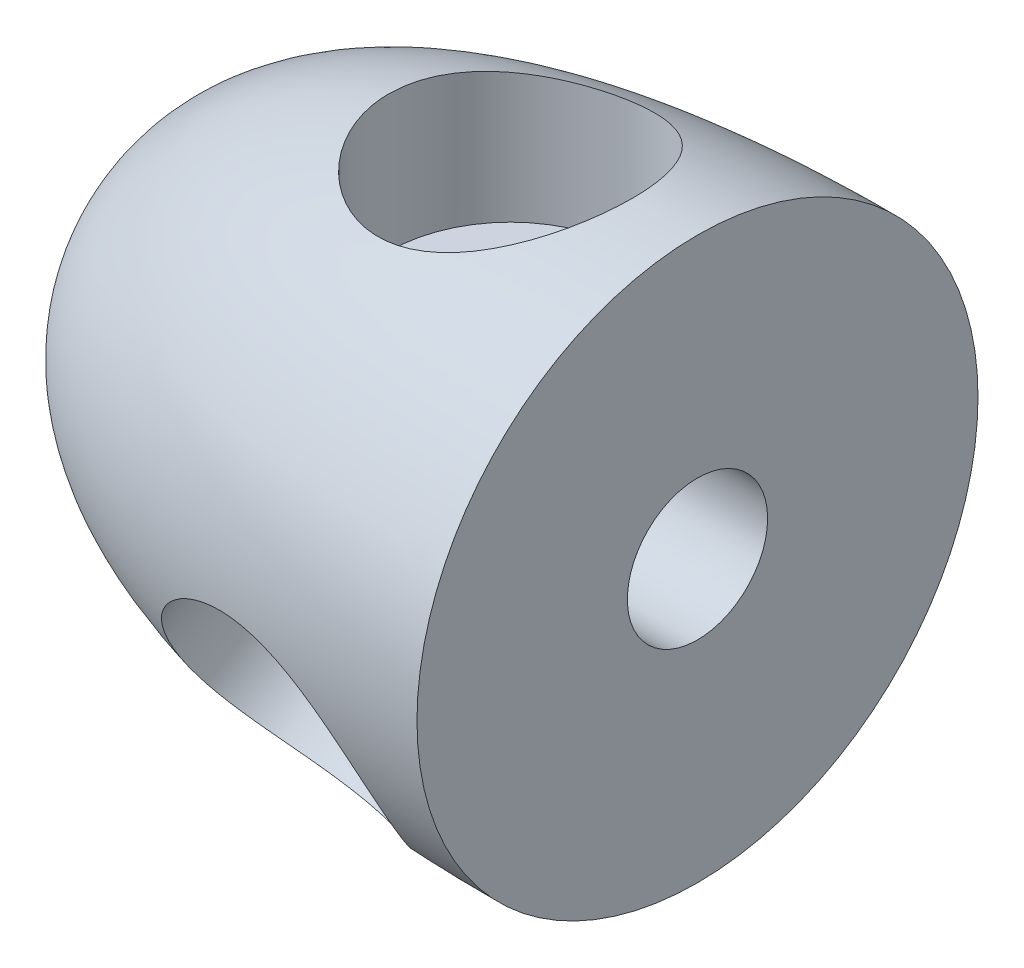
ISO-10303-21;
HEADER;
FILE_DESCRIPTION(('STEP AP214'),'2;1');
FILE_NAME('part.step','',(''),(''),'','','');
FILE_SCHEMA(('AUTOMOTIVE_DESIGN { 1 0 10303 214 1 1 1 1 }'));
ENDSEC;
DATA;
#1=APPLICATION_CONTEXT('core data for automotive mechanical design processes');
#2=APPLICATION_PROTOCOL_DEFINITION('international standard','automotive_design',2000,#1);
#3=PRODUCT_CONTEXT('',#1,'mechanical');
#4=PRODUCT('Part','Part','',(#3));
#5=PRODUCT_RELATED_PRODUCT_CATEGORY('part','',(#4));
#6=PRODUCT_DEFINITION_FORMATION('','',#4);
#7=PRODUCT_DEFINITION_CONTEXT('part definition',#1,'design');
#8=PRODUCT_DEFINITION('design','',#6,#7);
#9=PRODUCT_DEFINITION_SHAPE('','',#8);
#10=(LENGTH_UNIT() NAMED_UNIT(*) SI_UNIT(.MILLI.,.METRE.));
#11=(NAMED_UNIT(*) PLANE_ANGLE_UNIT() SI_UNIT($,.RADIAN.));
#12=(NAMED_UNIT(*) SI_UNIT($,.STERADIAN.) SOLID_ANGLE_UNIT());
#13=UNCERTAINTY_MEASURE_WITH_UNIT(LENGTH_MEASURE(1.E-05),#10,'distance_accuracy_value','');
#14=(GEOMETRIC_REPRESENTATION_CONTEXT(3) GLOBAL_UNCERTAINTY_ASSIGNED_CONTEXT((#13)) GLOBAL_UNIT_ASSIGNED_CONTEXT((#10,
#11,#12)) REPRESENTATION_CONTEXT('',''));
#15=CARTESIAN_POINT('',(0.,0.,0.));
#16=DIRECTION('',(0.,0.,1.));
#17=DIRECTION('',(1.,0.,0.));
#18=AXIS2_PLACEMENT_3D('',#15,#16,#17);
#19=CARTESIAN_POINT('',(0.,19.05,0.));
#20=CARTESIAN_POINT('',(-14.1990316571237,19.05,0.));
#21=CARTESIAN_POINT('',(-38.1,16.9337441759972,0.));
#22=CARTESIAN_POINT('',(-38.1,0.,0.));
#23=B_SPLINE_CURVE_WITH_KNOTS('',3,(#19,#20,#21,#22),.UNSPECIFIED.,.F.,.F.,(4,4),(0.,1.),.UNSPECIFIED.);
#24=CARTESIAN_POINT('',(0.,0.,0.));
#25=DIRECTION('',(1.,0.,0.));
#26=AXIS1_PLACEMENT('',#24,#25);
#27=SURFACE_OF_REVOLUTION('',#23,#26);
#28=CARTESIAN_POINT('',(-12.7,-1.05554135001207,18.3382512477111));
#29=CARTESIAN_POINT('',(-12.4678496731717,-1.07093817433811,18.3649182294069));
#30=CARTESIAN_POINT('',(-12.2361853486081,-1.09668677850686,18.3899135514848));
#31=CARTESIAN_POINT('',(-11.7756219296048,-1.1683230123203,18.4362695260958));
#32=CARTESIAN_POINT('',(-11.5467230720041,-1.21421235446174,18.457629869345));
#33=CARTESIAN_POINT('',(-11.093258589346,-1.32533467091383,18.4963258922248));
#34=CARTESIAN_POINT('',(-10.868694313289,-1.39057356697893,18.5136603368659));
#35=CARTESIAN_POINT('',(-10.4253438954722,-1.53942991294499,18.543823420776));
#36=CARTESIAN_POINT('',(-10.2065601958477,-1.62305499571124,18.5566501829566));
#37=CARTESIAN_POINT('',(-9.77696865141598,-1.80722726507867,18.5772041785311));
#38=CARTESIAN_POINT('',(-9.56613377152079,-1.90770925675279,18.5849505147031));
#39=CARTESIAN_POINT('',(-9.15269005922822,-2.12467383194726,18.5948372317379));
#40=CARTESIAN_POINT('',(-8.95008432704114,-2.2411623745741,18.596975518787));
#41=CARTESIAN_POINT('',(-8.3563654768225,-2.61281667795689,18.5940468730107));
#42=CARTESIAN_POINT('',(-7.97898978956349,-2.89032808962626,18.5796555798405));
#43=CARTESIAN_POINT('',(-7.24932499851591,-3.51234579087139,18.5191412013127));
#44=CARTESIAN_POINT('',(-6.89962515403691,-3.85973402987006,18.4712858372007));
#45=CARTESIAN_POINT('',(-6.41965144000054,-4.41361552426334,18.3701428901183));
#46=CARTESIAN_POINT('',(-6.26700842005648,-4.60383787953932,18.3315020373663));
#47=CARTESIAN_POINT('',(-5.97770345653988,-4.99374740063869,18.2437946413867));
#48=CARTESIAN_POINT('',(-5.84103430504733,-5.19343023997943,18.1947328288049));
#49=CARTESIAN_POINT('',(-5.58526199411527,-5.59996143913154,18.0858398892811));
#50=CARTESIAN_POINT('',(-5.46610156373598,-5.80678357463183,18.0260453625685));
#51=CARTESIAN_POINT('',(-5.24600408983275,-6.22637837158234,17.8952411710938));
#52=CARTESIAN_POINT('',(-5.14505832090734,-6.43914812721644,17.8242369068793));
#53=CARTESIAN_POINT('',(-4.96246806797866,-6.86874897192233,17.6708527449552));
#54=CARTESIAN_POINT('',(-4.88081692445505,-7.08557863175374,17.5884767877709));
#55=CARTESIAN_POINT('',(-4.73777797913458,-7.52131771194806,17.412410425798));
#56=CARTESIAN_POINT('',(-4.67638817080212,-7.74022692415689,17.318721142655));
#57=CARTESIAN_POINT('',(-4.57898498798811,-8.15947037285861,17.1287772814262));
#58=CARTESIAN_POINT('',(-4.5412655712239,-8.35981103963301,17.0334085242228));
#59=CARTESIAN_POINT('',(-4.48393789613877,-8.75875537955957,16.8339919722101));
#60=CARTESIAN_POINT('',(-4.46432856606679,-8.95735915481149,16.7299446913915));
#61=CARTESIAN_POINT('',(-4.44346638779167,-9.35110155372741,16.5139138842047));
#62=CARTESIAN_POINT('',(-4.44220761064571,-9.54624127625086,16.4019329329039));
#63=CARTESIAN_POINT('',(-4.45804742712007,-9.93152716618519,16.170908758721));
#64=CARTESIAN_POINT('',(-4.47514549995472,-10.1216734751029,16.051865736281));
#65=CARTESIAN_POINT('',(-4.5258861993133,-10.4841030877928,15.8152333169481));
#66=CARTESIAN_POINT('',(-4.55845701080148,-10.6567687933163,15.697997489485));
#67=CARTESIAN_POINT('',(-4.63924612753854,-10.9953216344241,15.4592331864884));
#68=CARTESIAN_POINT('',(-4.68746362640651,-11.1612091188405,15.3377049324605));
#69=CARTESIAN_POINT('',(-4.79906366205308,-11.4852941410762,15.0913980021993));
#70=CARTESIAN_POINT('',(-4.86244697861413,-11.6434912829771,14.9666191591242));
#71=CARTESIAN_POINT('',(-5.00378327196462,-11.9514291871467,14.7149017292706));
#72=CARTESIAN_POINT('',(-5.08173678845554,-12.1011696358995,14.5879630626474));
#73=CARTESIAN_POINT('',(-5.25391200458625,-12.3956390768418,14.3294700277123));
#74=CARTESIAN_POINT('',(-5.34852689622287,-12.5401117017246,14.1978856894738));
#75=CARTESIAN_POINT('',(-5.55169309063149,-12.8190293820455,13.9347442282574));
#76=CARTESIAN_POINT('',(-5.66024940049296,-12.9534708071959,13.8031871321501));
#77=CARTESIAN_POINT('',(-5.89047385877716,-13.2119141344801,13.5413133267622));
#78=CARTESIAN_POINT('',(-6.0121412221108,-13.3359166609035,13.4109965437197));
#79=CARTESIAN_POINT('',(-6.26779471884967,-13.5732684307527,13.1527264924107));
#80=CARTESIAN_POINT('',(-6.40178527657435,-13.6866138182442,13.0247740929696));
#81=CARTESIAN_POINT('',(-6.84480526438208,-14.0287096958183,12.6247300295763));
#82=CARTESIAN_POINT('',(-7.17539968096999,-14.2375303623417,12.3589373366593));
#83=CARTESIAN_POINT('',(-7.88325943146312,-14.6033733652481,11.8549834536762));
#84=CARTESIAN_POINT('',(-8.26054777438221,-14.760370023854,11.6168359990549));
#85=CARTESIAN_POINT('',(-8.86674926883624,-14.9605367051593,11.2824063208886));
#86=CARTESIAN_POINT('',(-9.08199463665295,-15.0225146747977,11.1720785174867));
#87=CARTESIAN_POINT('',(-9.52199859584118,-15.1317977233363,10.9639067326778));
#88=CARTESIAN_POINT('',(-9.74675346065383,-15.1791084905566,10.8660579202839));
#89=CARTESIAN_POINT('',(-10.2043999532849,-15.258987670139,10.6844029170312));
#90=CARTESIAN_POINT('',(-10.4372912782346,-15.2915566306165,10.600596204146));
#91=CARTESIAN_POINT('',(-10.9096555883844,-15.341863951998,10.4484923115474));
#92=CARTESIAN_POINT('',(-11.1491281591345,-15.3596032445911,10.3801941576893));
#93=CARTESIAN_POINT('',(-11.6236859720653,-15.3797670773218,10.2626882748266));
#94=CARTESIAN_POINT('',(-11.8585922921589,-15.3827478029013,10.2128538910677));
#95=CARTESIAN_POINT('',(-12.3310874850779,-15.3748316020286,10.1296824158725));
#96=CARTESIAN_POINT('',(-12.568676303217,-15.3639349579802,10.0963449887431));
#97=CARTESIAN_POINT('',(-13.0444822172277,-15.3282441475136,10.0468207934743));
#98=CARTESIAN_POINT('',(-13.2826989390589,-15.3034569406822,10.0306254483693));
#99=CARTESIAN_POINT('',(-13.7578253980251,-15.2400153123233,10.015636219971));
#100=CARTESIAN_POINT('',(-13.9947352176626,-15.2013617765646,10.0168412253516));
#101=CARTESIAN_POINT('',(-14.4468325037665,-15.113828609025,10.0357594501449));
#102=CARTESIAN_POINT('',(-14.6622753211812,-15.0659792503867,10.052180297517));
#103=CARTESIAN_POINT('',(-15.0886532303629,-14.9586889702085,10.0993142558216));
#104=CARTESIAN_POINT('',(-15.2995885805953,-14.8992487152985,10.1300265449479));
#105=CARTESIAN_POINT('',(-15.7154176894971,-14.768935242173,10.205089197667));
#106=CARTESIAN_POINT('',(-15.9203111805072,-14.6980615183428,10.2494401644727));
#107=CARTESIAN_POINT('',(-16.3226060284733,-14.5450794973276,10.3509023498163));
#108=CARTESIAN_POINT('',(-16.5200072357702,-14.4629709758772,10.4080138230898));
#109=CARTESIAN_POINT('',(-16.9047731851232,-14.2882993345626,10.5335508809668));
#110=CARTESIAN_POINT('',(-17.0921931315981,-14.1958050479399,10.6019032232757));
#111=CARTESIAN_POINT('',(-17.4572031591913,-14.0001636897908,10.7490491768934));
#112=CARTESIAN_POINT('',(-17.6347896427329,-13.8970127585634,10.8278465742137));
#113=CARTESIAN_POINT('',(-17.9789838177882,-13.6803640447362,10.9946390723192));
#114=CARTESIAN_POINT('',(-18.1455916398603,-13.566866385218,11.0826340636941));
#115=CARTESIAN_POINT('',(-18.46685777712,-13.3298309618759,11.2665617872103));
#116=CARTESIAN_POINT('',(-18.6215156654916,-13.2062928397596,11.3624948026209));
#117=CARTESIAN_POINT('',(-18.9250930939468,-12.9433707641879,11.5657845502716));
#118=CARTESIAN_POINT('',(-19.0733820940629,-12.8035110818781,11.6734684582794));
#119=CARTESIAN_POINT('',(-19.3548356830691,-12.5136897888083,11.894641716706));
#120=CARTESIAN_POINT('',(-19.4880064744523,-12.363732361336,12.0081286584156));
#121=CARTESIAN_POINT('',(-19.7384828380389,-12.0541461090567,12.2395685677634));
#122=CARTESIAN_POINT('',(-19.8557805208199,-11.8945125315625,12.3575237192323));
#123=CARTESIAN_POINT('',(-20.0735855498831,-11.5663747279972,12.5963917137113));
#124=CARTESIAN_POINT('',(-20.1740992941907,-11.3978739144723,12.7173034094455));
#125=CARTESIAN_POINT('',(-20.3591644265225,-11.0499238387093,12.9627496499754));
#126=CARTESIAN_POINT('',(-20.4434292117247,-10.8703409677531,13.0873111269466));
#127=CARTESIAN_POINT('',(-20.5932687876938,-10.5037464464385,13.3367558754058));
#128=CARTESIAN_POINT('',(-20.6588433137755,-10.3167346909173,13.4616391514257));
#129=CARTESIAN_POINT('',(-20.770756683274,-9.93643745243655,13.7104131336544));
#130=CARTESIAN_POINT('',(-20.817098242681,-9.74315285945709,13.8343039775849));
#131=CARTESIAN_POINT('',(-20.8901638498285,-9.35155993603963,14.0799092494355));
#132=CARTESIAN_POINT('',(-20.9168883734726,-9.15325172759381,14.2016237300836));
#133=CARTESIAN_POINT('',(-20.9500990228065,-8.75766040063276,14.4390075561227));
#134=CARTESIAN_POINT('',(-20.9570402290159,-8.56046020899384,14.5547516356647));
#135=CARTESIAN_POINT('',(-20.9519268496546,-8.16401731592111,14.7822493393943));
#136=CARTESIAN_POINT('',(-20.9398725474943,-7.96477464500489,14.8940030230925));
#137=CARTESIAN_POINT('',(-20.896870884421,-7.56574328093139,15.1127738289624));
#138=CARTESIAN_POINT('',(-20.8659244142849,-7.36595461396029,15.2197911742));
#139=CARTESIAN_POINT('',(-20.785395324947,-6.96735933493857,15.4285067385448));
#140=CARTESIAN_POINT('',(-20.7358126881345,-6.76855272381615,15.5302049526255));
#141=CARTESIAN_POINT('',(-20.6189474757692,-6.37529297170968,15.7269479952205));
#142=CARTESIAN_POINT('',(-20.5518307354046,-6.18081665149887,15.8220451181098));
#143=CARTESIAN_POINT('',(-20.400202947753,-5.79589205553348,16.0063283039084));
#144=CARTESIAN_POINT('',(-20.3156920463741,-5.60544374600532,16.095514416393));
#145=CARTESIAN_POINT('',(-20.1298929254751,-5.23009847528198,16.267852317792));
#146=CARTESIAN_POINT('',(-20.0286055031384,-5.04520125080431,16.3510043931607));
#147=CARTESIAN_POINT('',(-19.809908927268,-4.68237647023571,16.5113237467028));
#148=CARTESIAN_POINT('',(-19.6924936134865,-4.50445161086404,16.5884887203195));
#149=CARTESIAN_POINT('',(-19.4395968588325,-4.15330652739349,16.7385619807426));
#150=CARTESIAN_POINT('',(-19.3037755367243,-3.98027519848074,16.8113397137552));
#151=CARTESIAN_POINT('',(-19.0169676165429,-3.64458174542633,16.9510286897099));
#152=CARTESIAN_POINT('',(-18.865974022994,-3.48192446146757,17.0179371996549));
#153=CARTESIAN_POINT('',(-18.5498210086171,-3.16856153131007,17.1461981869966));
#154=CARTESIAN_POINT('',(-18.3846590336764,-3.0178580494689,17.2075496585189));
#155=CARTESIAN_POINT('',(-18.041337903279,-2.72999869525697,17.3250513596962));
#156=CARTESIAN_POINT('',(-17.8631848980244,-2.59283648365998,17.3812040223544));
#157=CARTESIAN_POINT('',(-17.4930256788642,-2.33205274810865,17.4893398325382));
#158=CARTESIAN_POINT('',(-17.3008927306071,-2.20859001621148,17.5412725230222));
#159=CARTESIAN_POINT('',(-16.9058854913818,-1.97837101014384,17.6407232174064));
#160=CARTESIAN_POINT('',(-16.7030157475732,-1.87160773814121,17.6882430670774));
#161=CARTESIAN_POINT('',(-16.2880017151978,-1.67606411202289,17.7792982731085));
#162=CARTESIAN_POINT('',(-16.0758602851245,-1.58727826229667,17.8228348448998));
#163=CARTESIAN_POINT('',(-15.6438830739543,-1.42879439254817,17.9062996597299));
#164=CARTESIAN_POINT('',(-15.4240479453297,-1.35909475830171,17.9462282077274));
#165=CARTESIAN_POINT('',(-14.9988002703656,-1.24513559089126,18.0192589376756));
#166=CARTESIAN_POINT('',(-14.7939023959221,-1.19913487739774,18.0526515532853));
#167=CARTESIAN_POINT('',(-14.3806283743852,-1.12411175471069,18.1168125362719));
#168=CARTESIAN_POINT('',(-14.1722525154871,-1.0950879458772,18.1475811198052));
#169=CARTESIAN_POINT('',(-13.7534652694448,-1.05426898031285,18.2065397002261));
#170=CARTESIAN_POINT('',(-13.5430539365775,-1.04247336545047,18.234729765663));
#171=CARTESIAN_POINT('',(-13.1216284295418,-1.03612460484565,18.2884890761011));
#172=CARTESIAN_POINT('',(-12.910614207848,-1.04157285811673,18.3140581082815));
#173=CARTESIAN_POINT('',(-12.7,-1.05554135001207,18.3382512477111));
#174=B_SPLINE_CURVE_WITH_KNOTS('',3,(#28,#29,#30,#31,#32,#33,#34,#35,#36,#37,#38,#39,#40,#41,
#42,#43,#44,#45,#46,#47,#48,#49,#50,#51,#52,#53,#54,#55,#56,#57,#58,#59,#60,#61,#62,#63,#64,#65,
#66,#67,#68,#69,#70,#71,#72,#73,#74,#75,#76,#77,#78,#79,#80,#81,#82,#83,#84,#85,#86,#87,#88,#89,
#90,#91,#92,#93,#94,#95,#96,#97,#98,#99,#100,#101,#102,#103,#104,#105,#106,#107,#108,#109,#110,
#111,#112,#113,#114,#115,#116,#117,#118,#119,#120,#121,#122,#123,#124,#125,#126,#127,#128,#129,
#130,#131,#132,#133,#134,#135,#136,#137,#138,#139,#140,#141,#142,#143,#144,#145,#146,#147,#148,
#149,#150,#151,#152,#153,#154,#155,#156,#157,#158,#159,#160,#161,#162,#163,#164,#165,#166,#167,
#168,#169,#170,#171,#172,#173),.UNSPECIFIED.,.T.,.F.,(4,2,2,2,2,2,2,2,2,2,2,2,2,2,2,2,2,2,2,2,2,
2,2,2,2,2,2,2,2,2,2,2,2,2,2,2,2,2,2,2,2,2,2,2,2,2,2,2,2,2,2,2,2,2,2,2,2,2,2,2,2,2,2,2,2,2,2,2,2,
2,2,2,4),(0.,0.702339120622019,1.40473797026374,2.10735200486445,2.81025827617057,
3.51050618010433,4.21101549045035,5.61086560693613,7.08912729085839,7.82918021875546,
8.56889791126588,9.30613938713547,10.0430267578773,10.7796594199906,11.5162191094459,
12.1905359600728,12.8648129022142,13.5388719850851,14.2129119453374,14.845872541714,
15.4788005224773,16.1117610535613,16.7447450350757,17.3953887111609,18.0462667242279,
18.6971057843924,19.3481794302539,20.7601187408642,22.1727565932035,22.9210362541201,
23.6690253487586,24.4169866301249,25.1649009165281,25.8844030072394,26.6038904563473,
27.3230177426413,28.0420990999006,28.7052040868324,29.3682709476951,30.0313671389682,
30.6944765686889,31.3534251274967,32.0126131913854,32.6717934147854,33.3309971712702,
34.0218032214971,34.7123248250816,35.4031883883205,36.0937879906624,36.7956339889221,
37.4974899259959,38.1992467164912,38.9009864820106,39.5864483266729,40.2718999444319,
40.9573192452344,41.6427391937341,42.3218975117989,43.0010501330818,43.6801704917745,
44.3595509739886,45.0538386351859,45.7484478932396,46.4431826316451,47.137590578343,
47.8393528833919,48.540820325749,49.2420730080971,49.9432663633927,50.5804686876965,
51.217618471234,51.8547513113994,52.4919358441607),.UNSPECIFIED.);
#175=CARTESIAN_POINT('',(-12.7,-1.05554135001207,18.3382512477111));
#176=VERTEX_POINT('',#175);
#177=EDGE_CURVE('E60',#176,#176,#174,.T.);
#178=ORIENTED_EDGE('',*,*,#177,.T.);
#179=EDGE_LOOP('',(#178));
#180=FACE_BOUND('',#179,.T.);
#181=CARTESIAN_POINT('',(0.,0.,0.));
#182=DIRECTION('',(1.,0.,0.));
#183=DIRECTION('',(0.,0.,-1.));
#184=AXIS2_PLACEMENT_3D('',#181,#182,#183);
#185=CIRCLE('',#184,19.05);
#186=CARTESIAN_POINT('',(0.,0.,-19.05));
#187=VERTEX_POINT('',#186);
#188=EDGE_CURVE('E11',#187,#187,#185,.T.);
#189=ORIENTED_EDGE('',*,*,#188,.F.);
#190=EDGE_LOOP('',(#189));
#191=FACE_BOUND('',#190,.T.);
#192=CARTESIAN_POINT('',(-38.1,0.,0.));
#193=VERTEX_POINT('',#192);
#194=VERTEX_LOOP('',#193);
#195=FACE_BOUND('',#194,.T.);
#196=CARTESIAN_POINT('',(-4.445,18.9763018383334,0.));
#197=CARTESIAN_POINT('',(-4.44499943134379,18.9763022513523,0.218211078954213));
#198=CARTESIAN_POINT('',(-4.45366030489562,18.9722345507482,0.436414421110941));
#199=CARTESIAN_POINT('',(-4.48819912989362,18.9560573129827,0.871144042653203));
#200=CARTESIAN_POINT('',(-4.51407624568471,18.9439481661432,1.08767040292133));
#201=CARTESIAN_POINT('',(-4.5827492203617,18.9119582977859,1.51743998162799));
#202=CARTESIAN_POINT('',(-4.62554556523899,18.8920773530295,1.73068310557535));
#203=CARTESIAN_POINT('',(-4.72758451760102,18.8449772614248,2.15236542127592));
#204=CARTESIAN_POINT('',(-4.7868274328471,18.8177579772558,2.36080452305338));
#205=CARTESIAN_POINT('',(-4.92095129342314,18.7566429551785,2.7708903116773));
#206=CARTESIAN_POINT('',(-4.99578642220544,18.7227667942276,2.97255493238313));
#207=CARTESIAN_POINT('',(-5.16051655688713,18.6489552318792,3.3685649330167));
#208=CARTESIAN_POINT('',(-5.25041720064804,18.6090175626559,3.56290753940635));
#209=CARTESIAN_POINT('',(-5.44447441549829,18.5238613882089,3.94308256356839));
#210=CARTESIAN_POINT('',(-5.54862802511466,18.4786439802919,4.12891673854075));
#211=CARTESIAN_POINT('',(-5.7704065226972,18.3837451781798,4.49120576491487));
#212=CARTESIAN_POINT('',(-5.88803667293001,18.3340620418671,4.66765691282271));
#213=CARTESIAN_POINT('',(-6.27247776874592,18.1743938736086,5.19895753091009));
#214=CARTESIAN_POINT('',(-6.56105520849356,18.0581933062236,5.53653946005926));
#215=CARTESIAN_POINT('',(-7.18688875477692,17.8182337172331,6.16002799663893));
#216=CARTESIAN_POINT('',(-7.52416652293216,17.6944713463876,6.44591148077657));
#217=CARTESIAN_POINT('',(-8.075032362928,17.5048624089158,6.84188005031169));
#218=CARTESIAN_POINT('',(-8.27412310592406,17.4385706693425,6.97232701290918));
#219=CARTESIAN_POINT('',(-8.6832034833614,17.3076613694495,7.21574423415549));
#220=CARTESIAN_POINT('',(-8.8931893128504,17.2430432363096,7.32872054004017));
#221=CARTESIAN_POINT('',(-9.32298727432609,17.1167773433105,7.5364327117597));
#222=CARTESIAN_POINT('',(-9.54280429529894,17.0551310937352,7.63115937505361));
#223=CARTESIAN_POINT('',(-9.99077041766749,16.9361654206379,7.80144100117607));
#224=CARTESIAN_POINT('',(-10.2189157078014,16.8788440538589,7.87700461082378));
#225=CARTESIAN_POINT('',(-10.6810817340575,16.7699796676345,8.00789634162892));
#226=CARTESIAN_POINT('',(-10.915069997073,16.7184108746828,8.06331745887122));
#227=CARTESIAN_POINT('',(-11.3883141110105,16.6218330055621,8.15368195587698));
#228=CARTESIAN_POINT('',(-11.6275699894649,16.5768239636885,8.18862522858259));
#229=CARTESIAN_POINT('',(-12.1093616786253,16.4943015195881,8.23739996769746));
#230=CARTESIAN_POINT('',(-12.3518953845436,16.4567835305268,8.25124438777343));
#231=CARTESIAN_POINT('',(-12.8383512777448,16.3898765340559,8.25742313991828));
#232=CARTESIAN_POINT('',(-13.0822733452249,16.360486835786,8.2497593006894));
#233=CARTESIAN_POINT('',(-13.5500666920895,16.3121849419798,8.2141955490019));
#234=CARTESIAN_POINT('',(-13.7739981611929,16.2926279706806,8.18794386022029));
#235=CARTESIAN_POINT('',(-14.2194536208659,16.2607395680525,8.11708934597051));
#236=CARTESIAN_POINT('',(-14.4409777431511,16.2484077394339,8.07248752975279));
#237=CARTESIAN_POINT('',(-14.8798611433481,16.2307519281812,7.96519068206703));
#238=CARTESIAN_POINT('',(-15.0972207562774,16.2254273794884,7.90249711257765));
#239=CARTESIAN_POINT('',(-15.5261128375097,16.2213314487669,7.75945953938697));
#240=CARTESIAN_POINT('',(-15.7376453175164,16.2225600535756,7.67911557113857));
#241=CARTESIAN_POINT('',(-16.1458493451855,16.2307647735812,7.50457508652718));
#242=CARTESIAN_POINT('',(-16.3427818032117,16.2375335018484,7.41097763621885));
#243=CARTESIAN_POINT('',(-16.7285220946098,16.2558279815828,7.2085708011828));
#244=CARTESIAN_POINT('',(-16.9173270009474,16.267355431275,7.09975599507692));
#245=CARTESIAN_POINT('',(-17.2854959240342,16.2943371027011,6.86772081906003));
#246=CARTESIAN_POINT('',(-17.4648623631159,16.3097903109181,6.74450417171298));
#247=CARTESIAN_POINT('',(-17.8132053981539,16.3437457334768,6.48439893158072));
#248=CARTESIAN_POINT('',(-17.9821771991442,16.3622493406748,6.34750410444134));
#249=CARTESIAN_POINT('',(-18.3152103577446,16.4021716796698,6.0552020567276));
#250=CARTESIAN_POINT('',(-18.4788031586039,16.4236775492973,5.89927264206554));
#251=CARTESIAN_POINT('',(-18.7925127217833,16.4679575197658,5.57469612528407));
#252=CARTESIAN_POINT('',(-18.9426348603364,16.4907311087182,5.40605414672928));
#253=CARTESIAN_POINT('',(-19.2286301557967,16.5365717949922,5.05697074579832));
#254=CARTESIAN_POINT('',(-19.3644953752555,16.55963904788,4.87652284035333));
#255=CARTESIAN_POINT('',(-19.6209749158734,16.6051017750843,4.5051133162269));
#256=CARTESIAN_POINT('',(-19.7415946638148,16.6274974862654,4.31415547360708));
#257=CARTESIAN_POINT('',(-19.9705384415983,16.6714619631989,3.91645812717439));
#258=CARTESIAN_POINT('',(-20.0783310898386,16.6929797023879,3.7094066978972));
#259=CARTESIAN_POINT('',(-20.2760805494961,16.7335167325747,3.28671169170762));
#260=CARTESIAN_POINT('',(-20.3660369351839,16.7525359639327,3.07106790985397));
#261=CARTESIAN_POINT('',(-20.5274109324961,16.7873321839229,2.63271795327241));
#262=CARTESIAN_POINT('',(-20.5988303724397,16.8031094922775,2.41001247748034));
#263=CARTESIAN_POINT('',(-20.722562794009,16.8308187150126,1.95912240708194));
#264=CARTESIAN_POINT('',(-20.7748762066429,16.8427507161377,1.73093793619868));
#265=CARTESIAN_POINT('',(-20.8593060388737,16.862167114619,1.27429743598263));
#266=CARTESIAN_POINT('',(-20.8917195441849,16.8697168369112,1.04589910122417));
#267=CARTESIAN_POINT('',(-20.9373234739617,16.8803732168368,0.587087582102007));
#268=CARTESIAN_POINT('',(-20.9505140528723,16.8834799101674,0.356674413941251));
#269=CARTESIAN_POINT('',(-20.9575590623122,16.8851367227884,-0.104440347798195));
#270=CARTESIAN_POINT('',(-20.9514154249216,16.8836872973746,-0.335141910254485));
#271=CARTESIAN_POINT('',(-20.9198488275686,16.8762856898303,-0.795147399904788));
#272=CARTESIAN_POINT('',(-20.8944260553329,16.8703335515439,-1.02445134068594));
#273=CARTESIAN_POINT('',(-20.8251796394353,16.8542978216727,-1.47566642527761));
#274=CARTESIAN_POINT('',(-20.7817131288763,16.844294502676,-1.69763536511263));
#275=CARTESIAN_POINT('',(-20.6767790931137,16.8205177309705,-2.13706508685164));
#276=CARTESIAN_POINT('',(-20.6153118310892,16.8067443333823,-2.35452593461618));
#277=CARTESIAN_POINT('',(-20.4748429442883,16.7759166603932,-2.78348371165803));
#278=CARTESIAN_POINT('',(-20.3958400141737,16.7588621407613,-2.99498019563224));
#279=CARTESIAN_POINT('',(-20.2208820840775,16.7220882441522,-3.4106008540994));
#280=CARTESIAN_POINT('',(-20.1249267862386,16.7023688203534,-3.61472489898095));
#281=CARTESIAN_POINT('',(-19.9152507115201,16.6606963729058,-4.01713681004682));
#282=CARTESIAN_POINT('',(-19.8012961766436,16.6387155152994,-4.21529999495602));
#283=CARTESIAN_POINT('',(-19.5573791104245,16.59361052211,-4.60147289753046));
#284=CARTESIAN_POINT('',(-19.4274110392003,16.5704859925392,-4.78947906883911));
#285=CARTESIAN_POINT('',(-19.1523473609163,16.5240435684958,-5.15406499324502));
#286=CARTESIAN_POINT('',(-19.007251176789,16.5007256666783,-5.33064431004404));
#287=CARTESIAN_POINT('',(-18.7028639548384,16.4549068223632,-5.67122668747626));
#288=CARTESIAN_POINT('',(-18.5435729261658,16.432405879339,-5.83522975621659));
#289=CARTESIAN_POINT('',(-18.2082997949424,16.3888182793481,-6.15289390050983));
#290=CARTESIAN_POINT('',(-18.0320365925405,16.3677714426269,-6.30626402781222));
#291=CARTESIAN_POINT('',(-17.6669985719096,16.3287725442074,-6.59761037834034));
#292=CARTESIAN_POINT('',(-17.478228421858,16.3108193367313,-6.73559229414101));
#293=CARTESIAN_POINT('',(-17.0894125157816,16.2791161063752,-6.99519281227402));
#294=CARTESIAN_POINT('',(-16.889366834499,16.2653660556375,-7.11681152305516));
#295=CARTESIAN_POINT('',(-16.4794404949569,16.2431229530751,-7.34272545937975));
#296=CARTESIAN_POINT('',(-16.2695601806697,16.2346297175373,-7.44702129022266));
#297=CARTESIAN_POINT('',(-15.846843295749,16.2239679681711,-7.63508923142588));
#298=CARTESIAN_POINT('',(-15.6342078120203,16.2216484058297,-7.71930467263199));
#299=CARTESIAN_POINT('',(-15.2027061818543,16.2236063462348,-7.86979620661556));
#300=CARTESIAN_POINT('',(-14.9838401404806,16.2278837378038,-7.93607260169483));
#301=CARTESIAN_POINT('',(-14.5416705436792,16.2435366764108,-8.05017966703607));
#302=CARTESIAN_POINT('',(-14.3183683840278,16.2549100239853,-8.09801604553765));
#303=CARTESIAN_POINT('',(-13.8690565522969,16.2850160434492,-8.17497883016267));
#304=CARTESIAN_POINT('',(-13.6430469587897,16.3037485022691,-8.20410577791869));
#305=CARTESIAN_POINT('',(-13.2001287722129,16.3475851515702,-8.24270071391807));
#306=CARTESIAN_POINT('',(-12.9832587176527,16.3723716608102,-8.25297956278081));
#307=CARTESIAN_POINT('',(-12.5502349894881,16.4284546173351,-8.25648073821801));
#308=CARTESIAN_POINT('',(-12.3340812920663,16.4597508459342,-8.24970363768083));
#309=CARTESIAN_POINT('',(-11.9039162661407,16.5284485636729,-8.21935372231391));
#310=CARTESIAN_POINT('',(-11.6899051983838,16.5658507865216,-8.19577888788662));
#311=CARTESIAN_POINT('',(-11.2653898823539,16.64618370406,-8.13221908669889));
#312=CARTESIAN_POINT('',(-11.0548857466542,16.6891145758361,-8.09223359420444));
#313=CARTESIAN_POINT('',(-10.6338161570039,16.7808431982724,-7.99522707089801));
#314=CARTESIAN_POINT('',(-10.4233607011008,16.8297531976165,-7.93783529342149));
#315=CARTESIAN_POINT('',(-10.0084968751876,16.9317810949619,-7.8069308486039));
#316=CARTESIAN_POINT('',(-9.80409071179038,16.9849005030748,-7.7334123789886));
#317=CARTESIAN_POINT('',(-9.40245624010733,17.0944027509829,-7.57087588740715));
#318=CARTESIAN_POINT('',(-9.20522770210208,17.1507854861857,-7.48185836201559));
#319=CARTESIAN_POINT('',(-8.81882669792664,17.2658656374413,-7.28890758005209));
#320=CARTESIAN_POINT('',(-8.62965715663943,17.3245638792324,-7.18496896691824));
#321=CARTESIAN_POINT('',(-8.24561480795967,17.4479936576519,-6.95396330630475));
#322=CARTESIAN_POINT('',(-8.05148701211849,17.51283347113,-6.82571370390461));
#323=CARTESIAN_POINT('',(-7.67479232092843,17.6427729116306,-6.55334562244744));
#324=CARTESIAN_POINT('',(-7.4922257989371,17.7078725469718,-6.40922663131863));
#325=CARTESIAN_POINT('',(-7.13959887008455,17.8371045845802,-6.10582430961552));
#326=CARTESIAN_POINT('',(-6.96954532382476,17.901236441142,-5.94653276845529));
#327=CARTESIAN_POINT('',(-6.64316766396307,18.0272158570368,-5.61374252666625));
#328=CARTESIAN_POINT('',(-6.48683852774354,18.0890642471906,-5.44024906870075));
#329=CARTESIAN_POINT('',(-6.18397708674226,18.2112529900304,-5.07393298898801));
#330=CARTESIAN_POINT('',(-6.03794013336339,18.2714757204343,-4.88066073077983));
#331=CARTESIAN_POINT('',(-5.76286113863549,18.3868246839636,-4.48106421555741));
#332=CARTESIAN_POINT('',(-5.63381174391549,18.4419531191463,-4.27474566350069));
#333=CARTESIAN_POINT('',(-5.39387427931388,18.5458517237852,-3.85031993357051));
#334=CARTESIAN_POINT('',(-5.28298283099717,18.5946230756837,-3.63221495872468));
#335=CARTESIAN_POINT('',(-5.08053103697097,18.6846193848879,-3.18571616470968));
#336=CARTESIAN_POINT('',(-4.98896895819432,18.7258450186968,-2.95732327018309));
#337=CARTESIAN_POINT('',(-4.83177436524714,18.7971889429844,-2.50776028463827));
#338=CARTESIAN_POINT('',(-4.76480738868525,18.8278697151789,-2.28714570360968));
#339=CARTESIAN_POINT('',(-4.64940119702293,18.8810226669957,-1.84015036763376));
#340=CARTESIAN_POINT('',(-4.60096113784778,18.9034952205771,-1.61376987587903));
#341=CARTESIAN_POINT('',(-4.52322695701243,18.9396710663129,-1.15715900084449));
#342=CARTESIAN_POINT('',(-4.4939238953158,18.9533784531385,-0.926930466844063));
#343=CARTESIAN_POINT('',(-4.45481114650818,18.9716934199942,-0.464464975361828));
#344=CARTESIAN_POINT('',(-4.44500060518446,18.9763013987838,-0.232228106338441));
#345=CARTESIAN_POINT('',(-4.445,18.9763018383334,0.));
#346=B_SPLINE_CURVE_WITH_KNOTS('',3,(#196,#197,#198,#199,#200,#201,#202,#203,#204,#205,#206,
#207,#208,#209,#210,#211,#212,#213,#214,#215,#216,#217,#218,#219,#220,#221,#222,#223,#224,#225,
#226,#227,#228,#229,#230,#231,#232,#233,#234,#235,#236,#237,#238,#239,#240,#241,#242,#243,#244,
#245,#246,#247,#248,#249,#250,#251,#252,#253,#254,#255,#256,#257,#258,#259,#260,#261,#262,#263,
#264,#265,#266,#267,#268,#269,#270,#271,#272,#273,#274,#275,#276,#277,#278,#279,#280,#281,#282,
#283,#284,#285,#286,#287,#288,#289,#290,#291,#292,#293,#294,#295,#296,#297,#298,#299,#300,#301,
#302,#303,#304,#305,#306,#307,#308,#309,#310,#311,#312,#313,#314,#315,#316,#317,#318,#319,#320,
#321,#322,#323,#324,#325,#326,#327,#328,#329,#330,#331,#332,#333,#334,#335,#336,#337,#338,#339,
#340,#341,#342,#343,#344,#345),.UNSPECIFIED.,.T.,.F.,(4,2,2,2,2,2,2,2,2,2,2,2,2,2,2,2,2,2,2,2,2,
2,2,2,2,2,2,2,2,2,2,2,2,2,2,2,2,2,2,2,2,2,2,2,2,2,2,2,2,2,2,2,2,2,2,2,2,2,2,2,2,2,2,2,2,2,2,2,2,
2,2,2,2,2,4),(0.,0.654411433519272,1.30879110503476,1.96318957445094,2.61760029031836,
3.27011452431898,3.92287349165931,4.5754970344735,5.22837628533623,6.59942211016501,
7.97107965748806,8.71157915998656,9.45182177191278,10.1924366861694,10.9327168206153,
11.6695343764557,12.4063557843322,13.1427246372924,13.8790308836721,14.5571090686166,
15.2351499644874,15.9131360838062,16.591120841323,17.2448277693707,17.8987681850216,
18.5525399434916,19.2066110546711,19.8869082783993,20.5669327718912,21.2473338780789,
21.9274921022916,22.6299027586448,23.3323301786492,24.0346882911209,24.7370305582888,
25.4286149867351,26.1201938586788,26.8117036229209,27.5032066538153,28.1816304430464,
28.860044313913,29.5385087021982,30.2169850124494,30.9051334400104,31.5935206044447,
32.2819340372734,32.9703470263216,33.6732742177604,34.3759405060636,35.0786021371458,
35.7812392105198,36.4665200148578,37.1517892703924,37.8368462252293,38.5218833469727,
39.1766884090502,39.831471477325,40.4863332836886,41.141216070929,41.8111646792679,
42.4813547270867,43.1515233066214,43.8219330762414,44.5457179815263,45.2695262486739,
45.9937284524931,46.7176645110476,47.4655556842198,48.213122047118,48.960549160719,
49.7079092316752,50.4047455253367,51.1015500677916,51.7980288578613,52.4944771257528),.UNSPECIFIED.);
#347=CARTESIAN_POINT('',(-4.445,18.9763018383334,0.));
#348=VERTEX_POINT('',#347);
#349=EDGE_CURVE('E55',#348,#348,#346,.T.);
#350=ORIENTED_EDGE('',*,*,#349,.T.);
#351=EDGE_LOOP('',(#350));
#352=FACE_BOUND('',#351,.T.);
#353=CARTESIAN_POINT('',(-12.7,-15.3536207664934,-10.083251247711));
#354=CARTESIAN_POINT('',(-12.4678496731717,-15.3690166379212,-10.1099187795629));
#355=CARTESIAN_POINT('',(-12.2361853486081,-15.377788919732,-10.1447153859239));
#356=CARTESIAN_POINT('',(-11.7756219296048,-15.3821162544556,-10.2299321715433));
#357=CARTESIAN_POINT('',(-11.5467230720041,-15.3776701832723,-10.2803536792253));
#358=CARTESIAN_POINT('',(-11.093258589346,-15.3556207638856,-10.3959364396402));
#359=CARTESIAN_POINT('',(-10.868694313289,-15.3380133852727,-10.4611022032679));
#360=CARTESIAN_POINT('',(-10.4253438954722,-15.2897072092124,-10.6050971223441));
#361=CARTESIAN_POINT('',(-10.2065601958477,-15.2590029697259,-10.6839319495035));
#362=CARTESIAN_POINT('',(-9.77696865141597,-15.1847171173589,-10.8537068112356));
#363=CARTESIAN_POINT('',(-9.56613377152078,-15.1411846454331,-10.9445999367343));
#364=CARTESIAN_POINT('',(-9.15269005922821,-15.041264505948,-11.1374401290914));
#365=CARTESIAN_POINT('',(-8.95008432704114,-14.9848720455397,-11.2393913097806));
#366=CARTESIAN_POINT('',(-8.3563654768225,-14.7965086122074,-11.5597890550478));
#367=CARTESIAN_POINT('',(-7.97898978956349,-14.645289680894,-11.7929253408084));
#368=CARTESIAN_POINT('',(-7.24932499851591,-14.2818738411721,-12.3013512824264));
#369=CARTESIAN_POINT('',(-6.89962515403691,-14.0667357606444,-12.5782706403192));
#370=CARTESIAN_POINT('',(-6.41965144000053,-13.7022026518608,-13.0073746116087));
#371=CARTESIAN_POINT('',(-6.26700842005648,-13.5736275141157,-13.1527915772694));
#372=CARTESIAN_POINT('',(-5.97770345653987,-13.3027159205479,-13.446609429729));
#373=CARTESIAN_POINT('',(-5.84103430504733,-13.160385724826,-13.595008935007));
#374=CARTESIAN_POINT('',(-5.58526199411527,-12.8628160733295,-13.8926288111418));
#375=CARTESIAN_POINT('',(-5.46610156373598,-12.707621426439,-14.0418447711937));
#376=CARTESIAN_POINT('',(-5.24600408983275,-12.3845442752252,-14.3398224289113));
#377=CARTESIAN_POINT('',(-5.14505832090734,-12.2166679008214,-14.4885843103402));
#378=CARTESIAN_POINT('',(-4.96246806797866,-11.869032897704,-14.7839374743807));
#379=CARTESIAN_POINT('',(-4.88081692445505,-11.6892783962056,-14.9305294894964));
#380=CARTESIAN_POINT('',(-4.73777797913458,-11.3189309138879,-15.2198574213799));
#381=CARTESIAN_POINT('',(-4.67638817080212,-11.1283390085194,-15.3625937187037));
#382=CARTESIAN_POINT('',(-4.57898498798812,-10.7542210750515,-15.6306972650352));
#383=CARTESIAN_POINT('',(-4.5412655712239,-10.5714589751988,-15.7565129932712));
#384=CARTESIAN_POINT('',(-4.48393789613877,-10.1992870052574,-16.0023006503373));
#385=CARTESIAN_POINT('',(-4.46432856606679,-10.0098775292478,-16.1222729245837));
#386=CARTESIAN_POINT('',(-4.44346638779167,-9.62591816276601,-16.3552484409985));
#387=CARTESIAN_POINT('',(-4.44220761064571,-9.43136995293791,-16.4682539223408));
#388=CARTESIAN_POINT('',(-4.45804742712007,-9.03865420424001,-16.6864092036522));
#389=CARTESIAN_POINT('',(-4.47514549995472,-8.8404867682048,-16.7915592263908));
#390=CARTESIAN_POINT('',(-4.5258861993133,-8.45434227535861,-16.9871162683975));
#391=CARTESIAN_POINT('',(-4.55845701080148,-8.26648021778014,-17.0780312420117));
#392=CARTESIAN_POINT('',(-4.63924612753854,-7.89042784531426,-17.2518444514361));
#393=CARTESIAN_POINT('',(-4.68746362640651,-7.70223754784032,-17.3347431000967));
#394=CARTESIAN_POINT('',(-4.79906366205308,-7.32688697798811,-17.4922554972083));
#395=CARTESIAN_POINT('',(-4.86244697861413,-7.13972675907986,-17.566868819363));
#396=CARTESIAN_POINT('',(-5.00378327196462,-6.76776411816652,-17.7076921522351));
#397=CARTESIAN_POINT('',(-5.08173678845555,-6.58296178377187,-17.7739018515176));
#398=CARTESIAN_POINT('',(-5.25391200458625,-6.21186552834561,-17.8996733505443));
#399=CARTESIAN_POINT('',(-5.34852689622287,-6.02567383624944,-17.9589981447249));
#400=CARTESIAN_POINT('',(-5.55169309063149,-5.65832780588665,-18.0689772108393));
#401=CARTESIAN_POINT('',(-5.66024940049295,-5.47717530603448,-18.1196283522868));
#402=CARTESIAN_POINT('',(-5.89047385877716,-5.12116427434069,-18.2125099364596));
#403=CARTESIAN_POINT('',(-6.0121412221108,-4.94630536647467,-18.2547408829545));
#404=CARTESIAN_POINT('',(-6.26779471884967,-4.60396105607981,-18.3311585196226));
#405=CARTESIAN_POINT('',(-6.40178527657435,-4.43647833394288,-18.3653423048715));
#406=CARTESIAN_POINT('',(-6.84480526438209,-3.91898207362411,-18.4615839936838));
#407=CARTESIAN_POINT('',(-7.17539968096999,-3.584388516156,-18.5095316492699));
#408=CARTESIAN_POINT('',(-7.88325943146312,-2.9650301497036,-18.574384042092));
#409=CARTESIAN_POINT('',(-8.26054777438222,-2.68029007485204,-18.5912734094434));
#410=CARTESIAN_POINT('',(-8.86674926883624,-2.29058213712795,-18.5974080013618));
#411=CARTESIAN_POINT('',(-9.08199463665296,-2.16404647181887,-18.5959185958427));
#412=CARTESIAN_POINT('',(-9.52199859584119,-1.92912289355397,-18.5864745996757));
#413=CARTESIAN_POINT('',(-9.74675346065383,-1.82072795268058,-18.578522519764));
#414=CARTESIAN_POINT('',(-10.2043999532849,-1.62347051534797,-18.5568724168895));
#415=CARTESIAN_POINT('',(-10.4372912782346,-1.53460729274302,-18.5431746075952));
#416=CARTESIAN_POINT('',(-10.9096555883844,-1.37772779704735,-18.5106900796087));
#417=CARTESIAN_POINT('',(-11.1491281591345,-1.3097102144781,-18.4919036807105));
#418=CARTESIAN_POINT('',(-11.6236859720653,-1.19786521845958,-18.4506131306615));
#419=CARTESIAN_POINT('',(-11.8585922921589,-1.15321701335262,-18.4282773228557));
#420=CARTESIAN_POINT('',(-12.3310874850779,-1.08514650339974,-18.3798359542008));
#421=CARTESIAN_POINT('',(-12.568676303217,-1.06172376663301,-18.3537304700742));
#422=CARTESIAN_POINT('',(-13.0444822172277,-1.03667996066159,-18.2980592238941));
#423=CARTESIAN_POINT('',(-13.2826989390589,-1.03504798379334,-18.2684952005367));
#424=CARTESIAN_POINT('',(-13.7578253980251,-1.05378774539669,-18.2060585245213));
#425=CARTESIAN_POINT('',(-13.9947352176626,-1.07415807854739,-18.1731860832985));
#426=CARTESIAN_POINT('',(-14.4468325037665,-1.13430832558267,-18.1068392489322));
#427=CARTESIAN_POINT('',(-14.6622753211812,-1.17245387587769,-18.0736109124826));
#428=CARTESIAN_POINT('',(-15.0886532303629,-1.26691822123951,-18.0042617834214));
#429=CARTESIAN_POINT('',(-15.2995885805953,-1.32323597128627,-17.9681411572251));
#430=CARTESIAN_POINT('',(-15.7154176894971,-1.45339887197921,-17.8928177054027));
#431=CARTESIAN_POINT('',(-15.9203111805072,-1.52724479783045,-17.8536147435077));
#432=CARTESIAN_POINT('',(-16.3226060284733,-1.69160463836906,-17.771859519658));
#433=CARTESIAN_POINT('',(-16.5200072357702,-1.78211888579668,-17.7293071908515));
#434=CARTESIAN_POINT('',(-16.9047731851232,-1.97817298769186,-17.6408056410909));
#435=CARTESIAN_POINT('',(-17.0921931315981,-2.08361499585081,-17.5948794103252));
#436=CARTESIAN_POINT('',(-17.4572031591913,-2.30886780882244,-17.499022000946));
#437=CARTESIAN_POINT('',(-17.6347896427329,-2.42868382226763,-17.4490893727392));
#438=CARTESIAN_POINT('',(-17.9789838177882,-2.68145471970121,-17.3448623319203));
#439=CARTESIAN_POINT('',(-18.1455916398603,-2.8144094473968,-17.290567971195));
#440=CARTESIAN_POINT('',(-18.46685777712,-3.0922132400931,-17.177253134742));
#441=CARTESIAN_POINT('',(-18.6215156654916,-3.23706272955851,-17.1182324903588));
#442=CARTESIAN_POINT('',(-18.9250930939468,-3.54457785313876,-16.9921801675233));
#443=CARTESIAN_POINT('',(-19.0733820940629,-3.70776469420718,-16.9249000836817));
#444=CARTESIAN_POINT('',(-19.3548356830691,-4.04421700117735,-16.7844941105389));
#445=CARTESIAN_POINT('',(-19.4880064744523,-4.21747828943174,-16.7113706397166));
#446=CARTESIAN_POINT('',(-19.7384828380389,-4.5727042565162,-16.5589810352542));
#447=CARTESIAN_POINT('',(-19.8557805208199,-4.75467320294265,-16.4797118775817));
#448=CARTESIAN_POINT('',(-20.0735855498831,-5.12560785609508,-16.3149702009915));
#449=CARTESIAN_POINT('',(-20.1740992941907,-5.31457086297806,-16.2295000637878));
#450=CARTESIAN_POINT('',(-20.3591644265225,-5.70110858042183,-16.0508895791932));
#451=CARTESIAN_POINT('',(-20.4434292117247,-5.89877341928991,-15.9576469893463));
#452=CARTESIAN_POINT('',(-20.5932687876938,-6.29809616895349,-15.7648891952292));
#453=CARTESIAN_POINT('',(-20.6588433137755,-6.4997541362551,-15.6653739021515));
#454=CARTESIAN_POINT('',(-20.770756683274,-6.90534734390616,-15.4604138237524));
#455=CARTESIAN_POINT('',(-20.817098242681,-7.10928225853604,-15.3549698780373));
#456=CARTESIAN_POINT('',(-20.8901638498285,-7.51777912497078,-15.1386430943409));
#457=CARTESIAN_POINT('',(-20.9168883734726,-7.72234106144337,-15.0277603883719));
#458=CARTESIAN_POINT('',(-20.9500990228065,-8.12571714872129,-14.8038601627264));
#459=CARTESIAN_POINT('',(-20.9570402290159,-8.32455455776179,-14.6909518269069));
#460=CARTESIAN_POINT('',(-20.9519268496546,-8.71979479503056,-14.4613710622209));
#461=CARTESIAN_POINT('',(-20.9398725474943,-8.91619765953784,-14.3446986895387));
#462=CARTESIAN_POINT('',(-20.896870884421,-9.30517441706426,-14.1085127942792));
#463=CARTESIAN_POINT('',(-20.8659244142849,-9.49774849017118,-13.9889994059128));
#464=CARTESIAN_POINT('',(-20.785395324947,-9.87779911056984,-13.7481635506239));
#465=CARTESIAN_POINT('',(-20.7358126881346,-10.0652756530444,-13.6268410819919));
#466=CARTESIAN_POINT('',(-20.6189474757692,-10.4322900020028,-13.3846396676793));
#467=CARTESIAN_POINT('',(-20.5518307354046,-10.6118846863571,-13.2637667953868));
#468=CARTESIAN_POINT('',(-20.400202947753,-10.9639409047317,-13.0225539096386));
#469=CARTESIAN_POINT('',(-20.3156920463741,-11.1364024985723,-12.9022138917218));
#470=CARTESIAN_POINT('',(-20.1298929254751,-11.4733241345804,-12.6633243027845));
#471=CARTESIAN_POINT('',(-20.0286055031384,-11.6377845564659,-12.5447746469819));
#472=CARTESIAN_POINT('',(-19.809908927268,-11.9580375796359,-12.3107188466581));
#473=CARTESIAN_POINT('',(-19.6924936134865,-12.1138268367562,-12.1952138852858));
#474=CARTESIAN_POINT('',(-19.4395968588325,-12.4193666344467,-11.9661499527978));
#475=CARTESIAN_POINT('',(-19.3037755367243,-12.5689096645218,-11.8526892928151));
#476=CARTESIAN_POINT('',(-19.0169676165429,-12.8577305928544,-11.6318147225632));
#477=CARTESIAN_POINT('',(-18.865974022994,-12.9970037041755,-11.5244036375169));
#478=CARTESIAN_POINT('',(-18.5498210086171,-13.2647624426066,-11.317153873067));
#479=CARTESIAN_POINT('',(-18.3846590336764,-13.3932461164252,-11.217316565115));
#480=CARTESIAN_POINT('',(-18.041337903279,-13.6389352517385,-11.0267739022391));
#481=CARTESIAN_POINT('',(-17.8631848980244,-13.7561459898891,-10.9360642738859));
#482=CARTESIAN_POINT('',(-17.4930256788642,-13.9801862163428,-10.7642868390966));
#483=CARTESIAN_POINT('',(-17.3008927306071,-14.0868926115373,-10.683331322095));
#484=CARTESIAN_POINT('',(-16.9058854913818,-14.2881289423319,-10.5336811615985));
#485=CARTESIAN_POINT('',(-16.7030157475732,-14.3826639753323,-10.4649813806886));
#486=CARTESIAN_POINT('',(-16.2880017151978,-14.5592919099612,-10.3411632359375));
#487=CARTESIAN_POINT('',(-16.0758602851245,-14.6413886119893,-10.2860407204737));
#488=CARTESIAN_POINT('',(-15.6438830739543,-14.7929131968286,-10.1905220705965));
#489=CARTESIAN_POINT('',(-15.4240479453296,-14.8623421508539,-10.1501246907033));
#490=CARTESIAN_POINT('',(-14.9988002703656,-14.9825682019512,-10.0879485217058));
#491=CARTESIAN_POINT('',(-14.7939023959221,-15.0344874121147,-10.0648070430331));
#492=CARTESIAN_POINT('',(-14.3806283743852,-15.1275640146565,-10.0319156044082));
#493=CARTESIAN_POINT('',(-14.1722525154871,-15.1687222940515,-10.0221645404104));
#494=CARTESIAN_POINT('',(-13.7534652694448,-15.2401914052493,-10.016293569486));
#495=CARTESIAN_POINT('',(-13.5430539365775,-15.2705025254831,-10.0201733000803));
#496=CARTESIAN_POINT('',(-13.1216284295418,-15.3202338343149,-10.0415547673331));
#497=CARTESIAN_POINT('',(-12.910614207848,-15.3396531390978,-10.0590576091623));
#498=CARTESIAN_POINT('',(-12.7,-15.3536207664934,-10.083251247711));
#499=B_SPLINE_CURVE_WITH_KNOTS('',3,(#353,#354,#355,#356,#357,#358,#359,#360,#361,#362,#363,
#364,#365,#366,#367,#368,#369,#370,#371,#372,#373,#374,#375,#376,#377,#378,#379,#380,#381,#382,
#383,#384,#385,#386,#387,#388,#389,#390,#391,#392,#393,#394,#395,#396,#397,#398,#399,#400,#401,
#402,#403,#404,#405,#406,#407,#408,#409,#410,#411,#412,#413,#414,#415,#416,#417,#418,#419,#420,
#421,#422,#423,#424,#425,#426,#427,#428,#429,#430,#431,#432,#433,#434,#435,#436,#437,#438,#439,
#440,#441,#442,#443,#444,#445,#446,#447,#448,#449,#450,#451,#452,#453,#454,#455,#456,#457,#458,
#459,#460,#461,#462,#463,#464,#465,#466,#467,#468,#469,#470,#471,#472,#473,#474,#475,#476,#477,
#478,#479,#480,#481,#482,#483,#484,#485,#486,#487,#488,#489,#490,#491,#492,#493,#494,#495,#496,
#497,#498),.UNSPECIFIED.,.T.,.F.,(4,2,2,2,2,2,2,2,2,2,2,2,2,2,2,2,2,2,2,2,2,2,2,2,2,2,2,2,2,2,2,
2,2,2,2,2,2,2,2,2,2,2,2,2,2,2,2,2,2,2,2,2,2,2,2,2,2,2,2,2,2,2,2,2,2,2,2,2,2,2,2,2,4),(0.,
0.702339120622019,1.40473797026374,2.10735200486445,2.81025827617057,3.51050618010434,
4.21101549045035,5.61086560693613,7.0891272908584,7.82918021875547,8.56889791126588,
9.30613938713548,10.0430267578774,10.7796594199906,11.5162191094459,12.1905359600729,
12.8648129022142,13.5388719850851,14.2129119453374,14.845872541714,15.4788005224773,
16.1117610535613,16.7447450350757,17.3953887111609,18.0462667242279,18.6971057843924,
19.3481794302539,20.7601187408642,22.1727565932036,22.9210362541201,23.6690253487586,
24.4169866301249,25.1649009165281,25.8844030072394,26.6038904563473,27.3230177426413,
28.0420990999006,28.7052040868324,29.3682709476951,30.0313671389682,30.6944765686889,
31.3534251274967,32.0126131913854,32.6717934147854,33.3309971712702,34.0218032214971,
34.7123248250816,35.4031883883205,36.0937879906624,36.7956339889221,37.4974899259959,
38.1992467164912,38.9009864820107,39.5864483266729,40.2718999444319,40.9573192452344,
41.6427391937341,42.3218975117989,43.0010501330818,43.6801704917746,44.3595509739887,
45.053838635186,45.7484478932397,46.4431826316451,47.137590578343,47.839352883392,
48.5408203257491,49.2420730080971,49.9432663633928,50.5804686876965,51.2176184712341,
51.8547513113994,52.4919358441607),.UNSPECIFIED.);
#500=CARTESIAN_POINT('',(-12.7,-15.3536207664934,-10.083251247711));
#501=VERTEX_POINT('',#500);
#502=EDGE_CURVE('E37',#501,#501,#499,.T.);
#503=ORIENTED_EDGE('',*,*,#502,.T.);
#504=EDGE_LOOP('',(#503));
#505=FACE_BOUND('',#504,.T.);
#506=ADVANCED_FACE('F33',(#180,#191,#195,#352,#505),#27,.F.);
#507=CARTESIAN_POINT('',(0.,0.,0.));
#508=DIRECTION('',(1.,0.,0.));
#509=DIRECTION('',(0.,0.,-1.));
#510=AXIS2_PLACEMENT_3D('',#507,#508,#509);
#511=PLANE('',#510);
#512=CARTESIAN_POINT('',(0.,0.,0.));
#513=DIRECTION('',(1.,0.,0.));
#514=DIRECTION('',(0.,0.,-1.));
#515=AXIS2_PLACEMENT_3D('',#512,#513,#514);
#516=CIRCLE('',#515,4.7625);
#517=CARTESIAN_POINT('',(0.,0.,-4.7625));
#518=VERTEX_POINT('',#517);
#519=EDGE_CURVE('E111',#518,#518,#516,.T.);
#520=ORIENTED_EDGE('',*,*,#519,.F.);
#521=EDGE_LOOP('',(#520));
#522=FACE_BOUND('',#521,.T.);
#523=ORIENTED_EDGE('',*,*,#188,.T.);
#524=EDGE_LOOP('',(#523));
#525=FACE_BOUND('',#524,.T.);
#526=ADVANCED_FACE('F35',(#522,#525),#511,.T.);
#527=CARTESIAN_POINT('',(-12.7,0.,0.));
#528=DIRECTION('',(1.,0.,0.));
#529=DIRECTION('',(0.,0.,-1.));
#530=AXIS2_PLACEMENT_3D('',#527,#528,#529);
#531=CYLINDRICAL_SURFACE('',#530,4.7625);
#532=CARTESIAN_POINT('',(-12.7,0.,0.));
#533=DIRECTION('',(1.,0.,0.));
#534=DIRECTION('',(0.,0.,-1.));
#535=AXIS2_PLACEMENT_3D('',#532,#533,#534);
#536=CIRCLE('',#535,4.7625);
#537=CARTESIAN_POINT('',(-12.7,0.,-4.7625));
#538=VERTEX_POINT('',#537);
#539=EDGE_CURVE('E45',#538,#538,#536,.T.);
#540=ORIENTED_EDGE('',*,*,#539,.F.);
#541=EDGE_LOOP('',(#540));
#542=FACE_BOUND('',#541,.T.);
#543=ORIENTED_EDGE('',*,*,#519,.T.);
#544=EDGE_LOOP('',(#543));
#545=FACE_BOUND('',#544,.T.);
#546=ADVANCED_FACE('F98',(#542,#545),#531,.F.);
#547=CARTESIAN_POINT('',(-12.7,0.,0.));
#548=DIRECTION('',(1.,0.,0.));
#549=DIRECTION('',(0.,0.,-1.));
#550=AXIS2_PLACEMENT_3D('',#547,#548,#549);
#551=PLANE('',#550);
#552=ORIENTED_EDGE('',*,*,#539,.T.);
#553=EDGE_LOOP('',(#552));
#554=FACE_BOUND('',#553,.T.);
#555=ADVANCED_FACE('F95',(#554),#551,.T.);
#556=CARTESIAN_POINT('',(-12.7,29.464,0.));
#557=DIRECTION('',(0.,-1.,0.));
#558=DIRECTION('',(0.,0.,-1.));
#559=AXIS2_PLACEMENT_3D('',#556,#557,#558);
#560=CYLINDRICAL_SURFACE('',#559,8.255);
#561=ORIENTED_EDGE('',*,*,#349,.F.);
#562=EDGE_LOOP('',(#561));
#563=FACE_BOUND('',#562,.T.);
#564=CARTESIAN_POINT('',(-12.7,7.62,0.));
#565=DIRECTION('',(0.,1.,0.));
#566=DIRECTION('',(0.,0.,1.));
#567=AXIS2_PLACEMENT_3D('',#564,#565,#566);
#568=CIRCLE('',#567,8.255);
#569=CARTESIAN_POINT('',(-12.7,7.62,8.255));
#570=VERTEX_POINT('',#569);
#571=EDGE_CURVE('E59',#570,#570,#568,.T.);
#572=ORIENTED_EDGE('',*,*,#571,.F.);
#573=EDGE_LOOP('',(#572));
#574=FACE_BOUND('',#573,.T.);
#575=ADVANCED_FACE('F90',(#563,#574),#560,.F.);
#576=CARTESIAN_POINT('',(-12.7,7.62,0.));
#577=DIRECTION('',(0.,1.,0.));
#578=DIRECTION('',(0.,0.,1.));
#579=AXIS2_PLACEMENT_3D('',#576,#577,#578);
#580=PLANE('',#579);
#581=ORIENTED_EDGE('',*,*,#571,.T.);
#582=EDGE_LOOP('',(#581));
#583=FACE_BOUND('',#582,.T.);
#584=ADVANCED_FACE('F87',(#583),#580,.T.);
#585=CARTESIAN_POINT('',(-12.7,-14.7319999999998,25.5165724971048));
#586=DIRECTION('',(0.,0.499999999999992,-0.866025403784443));
#587=DIRECTION('',(0.,0.866025403784443,0.499999999999992));
#588=AXIS2_PLACEMENT_3D('',#585,#586,#587);
#589=CYLINDRICAL_SURFACE('',#588,8.255);
#590=ORIENTED_EDGE('',*,*,#177,.F.);
#591=EDGE_LOOP('',(#590));
#592=FACE_BOUND('',#591,.T.);
#593=CARTESIAN_POINT('',(-12.7,-3.80999999999994,6.59911357683746));
#594=DIRECTION('',(0.,-0.499999999999992,0.866025403784443));
#595=DIRECTION('',(0.,-0.866025403784443,-0.499999999999992));
#596=AXIS2_PLACEMENT_3D('',#593,#594,#595);
#597=CIRCLE('',#596,8.255);
#598=CARTESIAN_POINT('',(-12.7,-10.9590397082405,2.47161357683752));
#599=VERTEX_POINT('',#598);
#600=EDGE_CURVE('E67',#599,#599,#597,.T.);
#601=ORIENTED_EDGE('',*,*,#600,.F.);
#602=EDGE_LOOP('',(#601));
#603=FACE_BOUND('',#602,.T.);
#604=ADVANCED_FACE('F81',(#592,#603),#589,.F.);
#605=CARTESIAN_POINT('',(-12.7,-3.80999999999994,6.59911357683746));
#606=DIRECTION('',(0.,-0.499999999999992,0.866025403784443));
#607=DIRECTION('',(0.,-0.866025403784443,-0.499999999999992));
#608=AXIS2_PLACEMENT_3D('',#605,#606,#607);
#609=PLANE('',#608);
#610=ORIENTED_EDGE('',*,*,#600,.T.);
#611=EDGE_LOOP('',(#610));
#612=FACE_BOUND('',#611,.T.);
#613=ADVANCED_FACE('F86',(#612),#609,.T.);
#614=CARTESIAN_POINT('',(-12.7,-14.7320000000001,-25.5165724971047));
#615=DIRECTION('',(0.,0.500000000000004,0.866025403784436));
#616=DIRECTION('',(0.,-0.866025403784436,0.500000000000004));
#617=AXIS2_PLACEMENT_3D('',#614,#615,#616);
#618=CYLINDRICAL_SURFACE('',#617,8.255);
#619=ORIENTED_EDGE('',*,*,#502,.F.);
#620=EDGE_LOOP('',(#619));
#621=FACE_BOUND('',#620,.T.);
#622=CARTESIAN_POINT('',(-12.7,-3.81000000000003,-6.59911357683741));
#623=DIRECTION('',(0.,-0.500000000000004,-0.866025403784436));
#624=DIRECTION('',(0.,0.866025403784436,-0.500000000000004));
#625=AXIS2_PLACEMENT_3D('',#622,#623,#624);
#626=CIRCLE('',#625,8.255);
#627=CARTESIAN_POINT('',(-12.7,3.33903970824049,-10.7266135768374));
#628=VERTEX_POINT('',#627);
#629=EDGE_CURVE('E64',#628,#628,#626,.T.);
#630=ORIENTED_EDGE('',*,*,#629,.F.);
#631=EDGE_LOOP('',(#630));
#632=FACE_BOUND('',#631,.T.);
#633=ADVANCED_FACE('F126',(#621,#632),#618,.F.);
#634=CARTESIAN_POINT('',(-12.7,-3.81000000000003,-6.59911357683741));
#635=DIRECTION('',(0.,-0.500000000000004,-0.866025403784436));
#636=DIRECTION('',(0.,0.866025403784436,-0.500000000000004));
#637=AXIS2_PLACEMENT_3D('',#634,#635,#636);
#638=PLANE('',#637);
#639=ORIENTED_EDGE('',*,*,#629,.T.);
#640=EDGE_LOOP('',(#639));
#641=FACE_BOUND('',#640,.T.);
#642=ADVANCED_FACE('F130',(#641),#638,.T.);
#643=CLOSED_SHELL('',(#506,#526,#546,#555,#575,#584,#604,#613,#633,#642));
#644=MANIFOLD_SOLID_BREP('B2',#643);
#645=ADVANCED_BREP_SHAPE_REPRESENTATION('',(#18,#644),#14);
#646=SHAPE_DEFINITION_REPRESENTATION(#9,#645);
ENDSEC;
END-ISO-10303-21;
